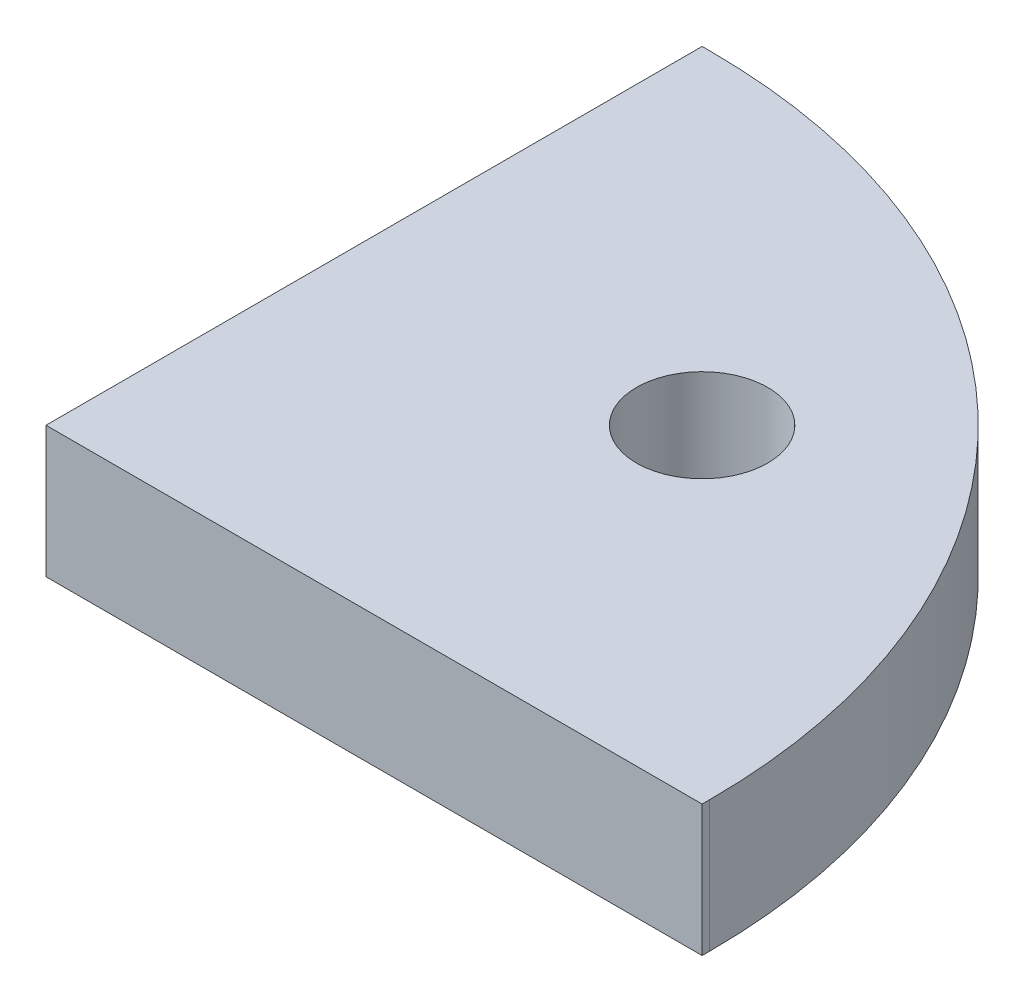
ISO-10303-21;
HEADER;
FILE_DESCRIPTION(('STEP AP214'),'2;1');
FILE_NAME('part.step','',(''),(''),'','','');
FILE_SCHEMA(('AUTOMOTIVE_DESIGN { 1 0 10303 214 1 1 1 1 }'));
ENDSEC;
DATA;
#1=APPLICATION_CONTEXT('core data for automotive mechanical design processes');
#2=APPLICATION_PROTOCOL_DEFINITION('international standard','automotive_design',2000,#1);
#3=PRODUCT_CONTEXT('',#1,'mechanical');
#4=PRODUCT('Part','Part','',(#3));
#5=PRODUCT_RELATED_PRODUCT_CATEGORY('part','',(#4));
#6=PRODUCT_DEFINITION_FORMATION('','',#4);
#7=PRODUCT_DEFINITION_CONTEXT('part definition',#1,'design');
#8=PRODUCT_DEFINITION('design','',#6,#7);
#9=PRODUCT_DEFINITION_SHAPE('','',#8);
#10=(LENGTH_UNIT() NAMED_UNIT(*) SI_UNIT(.MILLI.,.METRE.));
#11=(NAMED_UNIT(*) PLANE_ANGLE_UNIT() SI_UNIT($,.RADIAN.));
#12=(NAMED_UNIT(*) SI_UNIT($,.STERADIAN.) SOLID_ANGLE_UNIT());
#13=UNCERTAINTY_MEASURE_WITH_UNIT(LENGTH_MEASURE(1.E-05),#10,'distance_accuracy_value','');
#14=(GEOMETRIC_REPRESENTATION_CONTEXT(3) GLOBAL_UNCERTAINTY_ASSIGNED_CONTEXT((#13)) GLOBAL_UNIT_ASSIGNED_CONTEXT((#10,
#11,#12)) REPRESENTATION_CONTEXT('',''));
#15=CARTESIAN_POINT('',(0.,0.,0.));
#16=DIRECTION('',(0.,0.,1.));
#17=DIRECTION('',(1.,0.,0.));
#18=AXIS2_PLACEMENT_3D('',#15,#16,#17);
#19=CARTESIAN_POINT('',(-25.,10.,25.));
#20=DIRECTION('',(1.,0.,0.));
#21=DIRECTION('',(0.,0.,-1.));
#22=AXIS2_PLACEMENT_3D('',#19,#20,#21);
#23=PLANE('',#22);
#24=DIRECTION('',(0.,0.,1.));
#25=VECTOR('',#24,1.);
#26=CARTESIAN_POINT('',(-25.,0.,25.));
#27=LINE('',#26,#25);
#28=CARTESIAN_POINT('',(-25.,0.,-25.));
#29=VERTEX_POINT('',#28);
#30=CARTESIAN_POINT('',(-25.,0.,25.));
#31=VERTEX_POINT('',#30);
#32=EDGE_CURVE('E107',#29,#31,#27,.T.);
#33=ORIENTED_EDGE('',*,*,#32,.T.);
#34=DIRECTION('',(0.,-1.,0.));
#35=VECTOR('',#34,1.);
#36=CARTESIAN_POINT('',(-25.,10.,25.));
#37=LINE('',#36,#35);
#38=CARTESIAN_POINT('',(-25.,10.,25.));
#39=VERTEX_POINT('',#38);
#40=EDGE_CURVE('E11',#39,#31,#37,.T.);
#41=ORIENTED_EDGE('',*,*,#40,.F.);
#42=DIRECTION('',(0.,0.,1.));
#43=VECTOR('',#42,1.);
#44=CARTESIAN_POINT('',(-25.,10.,25.));
#45=LINE('',#44,#43);
#46=CARTESIAN_POINT('',(-25.,10.,-25.));
#47=VERTEX_POINT('',#46);
#48=EDGE_CURVE('E116',#47,#39,#45,.T.);
#49=ORIENTED_EDGE('',*,*,#48,.F.);
#50=DIRECTION('',(0.,-1.,0.));
#51=VECTOR('',#50,1.);
#52=CARTESIAN_POINT('',(-25.,10.,-25.));
#53=LINE('',#52,#51);
#54=EDGE_CURVE('E103',#47,#29,#53,.T.);
#55=ORIENTED_EDGE('',*,*,#54,.T.);
#56=EDGE_LOOP('',(#33,#41,#49,#55));
#57=FACE_BOUND('',#56,.T.);
#58=ADVANCED_FACE('F33',(#57),#23,.F.);
#59=CARTESIAN_POINT('',(-25.,10.,25.));
#60=DIRECTION('',(0.,0.,-1.));
#61=DIRECTION('',(-1.,0.,0.));
#62=AXIS2_PLACEMENT_3D('',#59,#60,#61);
#63=PLANE('',#62);
#64=DIRECTION('',(1.,0.,0.));
#65=VECTOR('',#64,1.);
#66=CARTESIAN_POINT('',(-25.,0.,25.));
#67=LINE('',#66,#65);
#68=CARTESIAN_POINT('',(25.,0.,25.));
#69=VERTEX_POINT('',#68);
#70=EDGE_CURVE('E110',#31,#69,#67,.T.);
#71=ORIENTED_EDGE('',*,*,#70,.T.);
#72=DIRECTION('',(0.,-1.,0.));
#73=VECTOR('',#72,1.);
#74=CARTESIAN_POINT('',(25.,10.,25.));
#75=LINE('',#74,#73);
#76=CARTESIAN_POINT('',(25.,10.,25.));
#77=VERTEX_POINT('',#76);
#78=EDGE_CURVE('E41',#77,#69,#75,.T.);
#79=ORIENTED_EDGE('',*,*,#78,.F.);
#80=DIRECTION('',(1.,0.,0.));
#81=VECTOR('',#80,1.);
#82=CARTESIAN_POINT('',(-25.,10.,25.));
#83=LINE('',#82,#81);
#84=EDGE_CURVE('E83',#39,#77,#83,.T.);
#85=ORIENTED_EDGE('',*,*,#84,.F.);
#86=ORIENTED_EDGE('',*,*,#40,.T.);
#87=EDGE_LOOP('',(#71,#79,#85,#86));
#88=FACE_BOUND('',#87,.T.);
#89=ADVANCED_FACE('F136',(#88),#63,.F.);
#90=CARTESIAN_POINT('',(25.,10.,25.));
#91=DIRECTION('',(-1.,0.,0.));
#92=DIRECTION('',(0.,0.,1.));
#93=AXIS2_PLACEMENT_3D('',#90,#91,#92);
#94=PLANE('',#93);
#95=DIRECTION('',(0.,0.,-1.));
#96=VECTOR('',#95,1.);
#97=CARTESIAN_POINT('',(25.,0.,25.));
#98=LINE('',#97,#96);
#99=CARTESIAN_POINT('',(25.,0.,24.4313090401671));
#100=VERTEX_POINT('',#99);
#101=EDGE_CURVE('E98',#69,#100,#98,.T.);
#102=ORIENTED_EDGE('',*,*,#101,.T.);
#103=DIRECTION('',(0.,-1.,0.));
#104=VECTOR('',#103,1.);
#105=CARTESIAN_POINT('',(25.,10.,24.4313090401671));
#106=LINE('',#105,#104);
#107=CARTESIAN_POINT('',(25.,10.,24.4313090401671));
#108=VERTEX_POINT('',#107);
#109=EDGE_CURVE('E95',#108,#100,#106,.T.);
#110=ORIENTED_EDGE('',*,*,#109,.F.);
#111=DIRECTION('',(0.,0.,-1.));
#112=VECTOR('',#111,1.);
#113=CARTESIAN_POINT('',(25.,10.,25.));
#114=LINE('',#113,#112);
#115=EDGE_CURVE('E87',#77,#108,#114,.T.);
#116=ORIENTED_EDGE('',*,*,#115,.F.);
#117=ORIENTED_EDGE('',*,*,#78,.T.);
#118=EDGE_LOOP('',(#102,#110,#116,#117));
#119=FACE_BOUND('',#118,.T.);
#120=ADVANCED_FACE('F96',(#119),#94,.F.);
#121=CARTESIAN_POINT('',(-24.4313090401668,10.,24.4313090401668));
#122=DIRECTION('',(0.,-1.,0.));
#123=DIRECTION('',(0.,0.,-1.));
#124=AXIS2_PLACEMENT_3D('',#121,#122,#123);
#125=CYLINDRICAL_SURFACE('',#124,49.4313090401668);
#126=CARTESIAN_POINT('',(-24.4313090401668,0.,24.4313090401668));
#127=DIRECTION('',(0.,1.,0.));
#128=DIRECTION('',(0.,0.,1.));
#129=AXIS2_PLACEMENT_3D('',#126,#127,#128);
#130=CIRCLE('',#129,49.4313090401668);
#131=CARTESIAN_POINT('',(-24.4313090401671,0.,-25.));
#132=VERTEX_POINT('',#131);
#133=EDGE_CURVE('E69',#100,#132,#130,.T.);
#134=ORIENTED_EDGE('',*,*,#133,.T.);
#135=DIRECTION('',(0.,-1.,0.));
#136=VECTOR('',#135,1.);
#137=CARTESIAN_POINT('',(-24.4313090401671,10.,-25.));
#138=LINE('',#137,#136);
#139=CARTESIAN_POINT('',(-24.4313090401671,10.,-25.));
#140=VERTEX_POINT('',#139);
#141=EDGE_CURVE('E99',#140,#132,#138,.T.);
#142=ORIENTED_EDGE('',*,*,#141,.F.);
#143=CARTESIAN_POINT('',(-24.4313090401668,10.,24.4313090401668));
#144=DIRECTION('',(0.,1.,0.));
#145=DIRECTION('',(0.,0.,1.));
#146=AXIS2_PLACEMENT_3D('',#143,#144,#145);
#147=CIRCLE('',#146,49.4313090401668);
#148=EDGE_CURVE('E91',#108,#140,#147,.T.);
#149=ORIENTED_EDGE('',*,*,#148,.F.);
#150=ORIENTED_EDGE('',*,*,#109,.T.);
#151=EDGE_LOOP('',(#134,#142,#149,#150));
#152=FACE_BOUND('',#151,.T.);
#153=ADVANCED_FACE('F101',(#152),#125,.T.);
#154=CARTESIAN_POINT('',(-25.,10.,-25.));
#155=DIRECTION('',(0.,0.,1.));
#156=DIRECTION('',(1.,0.,0.));
#157=AXIS2_PLACEMENT_3D('',#154,#155,#156);
#158=PLANE('',#157);
#159=DIRECTION('',(-1.,0.,0.));
#160=VECTOR('',#159,1.);
#161=CARTESIAN_POINT('',(-25.,0.,-25.));
#162=LINE('',#161,#160);
#163=EDGE_CURVE('E75',#132,#29,#162,.T.);
#164=ORIENTED_EDGE('',*,*,#163,.T.);
#165=ORIENTED_EDGE('',*,*,#54,.F.);
#166=DIRECTION('',(-1.,0.,0.));
#167=VECTOR('',#166,1.);
#168=CARTESIAN_POINT('',(-25.,10.,-25.));
#169=LINE('',#168,#167);
#170=EDGE_CURVE('E49',#140,#47,#169,.T.);
#171=ORIENTED_EDGE('',*,*,#170,.F.);
#172=ORIENTED_EDGE('',*,*,#141,.T.);
#173=EDGE_LOOP('',(#164,#165,#171,#172));
#174=FACE_BOUND('',#173,.T.);
#175=ADVANCED_FACE('F124',(#174),#158,.F.);
#176=CARTESIAN_POINT('',(-24.4313090401668,10.,24.4313090401668));
#177=DIRECTION('',(0.,1.,0.));
#178=DIRECTION('',(0.,0.,1.));
#179=AXIS2_PLACEMENT_3D('',#176,#177,#178);
#180=PLANE('',#179);
#181=CARTESIAN_POINT('',(0.,10.,0.));
#182=DIRECTION('',(0.,1.,0.));
#183=DIRECTION('',(0.,0.,1.));
#184=AXIS2_PLACEMENT_3D('',#181,#182,#183);
#185=CIRCLE('',#184,5.);
#186=CARTESIAN_POINT('',(0.,10.,5.));
#187=VERTEX_POINT('',#186);
#188=EDGE_CURVE('E187',#187,#187,#185,.T.);
#189=ORIENTED_EDGE('',*,*,#188,.F.);
#190=EDGE_LOOP('',(#189));
#191=FACE_BOUND('',#190,.T.);
#192=ORIENTED_EDGE('',*,*,#48,.T.);
#193=ORIENTED_EDGE('',*,*,#84,.T.);
#194=ORIENTED_EDGE('',*,*,#115,.T.);
#195=ORIENTED_EDGE('',*,*,#148,.T.);
#196=ORIENTED_EDGE('',*,*,#170,.T.);
#197=EDGE_LOOP('',(#192,#193,#194,#195,#196));
#198=FACE_BOUND('',#197,.T.);
#199=ADVANCED_FACE('F89',(#191,#198),#180,.T.);
#200=CARTESIAN_POINT('',(-24.4313090401668,0.,24.4313090401668));
#201=DIRECTION('',(0.,1.,0.));
#202=DIRECTION('',(0.,0.,1.));
#203=AXIS2_PLACEMENT_3D('',#200,#201,#202);
#204=PLANE('',#203);
#205=CARTESIAN_POINT('',(0.,0.,0.));
#206=DIRECTION('',(0.,1.,0.));
#207=DIRECTION('',(0.,0.,1.));
#208=AXIS2_PLACEMENT_3D('',#205,#206,#207);
#209=CIRCLE('',#208,5.);
#210=CARTESIAN_POINT('',(0.,0.,5.));
#211=VERTEX_POINT('',#210);
#212=EDGE_CURVE('E111',#211,#211,#209,.T.);
#213=ORIENTED_EDGE('',*,*,#212,.T.);
#214=EDGE_LOOP('',(#213));
#215=FACE_BOUND('',#214,.T.);
#216=ORIENTED_EDGE('',*,*,#32,.F.);
#217=ORIENTED_EDGE('',*,*,#163,.F.);
#218=ORIENTED_EDGE('',*,*,#133,.F.);
#219=ORIENTED_EDGE('',*,*,#101,.F.);
#220=ORIENTED_EDGE('',*,*,#70,.F.);
#221=EDGE_LOOP('',(#216,#217,#218,#219,#220));
#222=FACE_BOUND('',#221,.T.);
#223=ADVANCED_FACE('F120',(#215,#222),#204,.F.);
#224=CARTESIAN_POINT('',(0.,0.,0.));
#225=DIRECTION('',(0.,1.,0.));
#226=DIRECTION('',(0.,0.,1.));
#227=AXIS2_PLACEMENT_3D('',#224,#225,#226);
#228=CYLINDRICAL_SURFACE('',#227,5.);
#229=ORIENTED_EDGE('',*,*,#212,.F.);
#230=EDGE_LOOP('',(#229));
#231=FACE_BOUND('',#230,.T.);
#232=ORIENTED_EDGE('',*,*,#188,.T.);
#233=EDGE_LOOP('',(#232));
#234=FACE_BOUND('',#233,.T.);
#235=ADVANCED_FACE('F169',(#231,#234),#228,.F.);
#236=CLOSED_SHELL('',(#58,#89,#120,#153,#175,#199,#223,#235));
#237=MANIFOLD_SOLID_BREP('B2',#236);
#238=ADVANCED_BREP_SHAPE_REPRESENTATION('',(#18,#237),#14);
#239=SHAPE_DEFINITION_REPRESENTATION(#9,#238);
ENDSEC;
END-ISO-10303-21;
